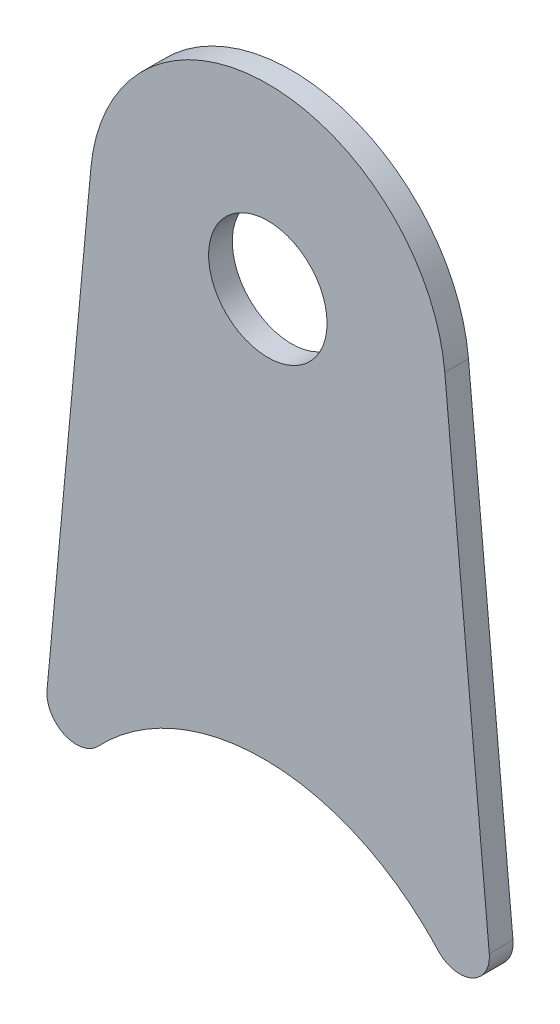
ISO-10303-21;
HEADER;
FILE_DESCRIPTION(('STEP AP214'),'2;1');
FILE_NAME('part.step','',(''),(''),'','','');
FILE_SCHEMA(('AUTOMOTIVE_DESIGN { 1 0 10303 214 1 1 1 1 }'));
ENDSEC;
DATA;
#1=APPLICATION_CONTEXT('core data for automotive mechanical design processes');
#2=APPLICATION_PROTOCOL_DEFINITION('international standard','automotive_design',2000,#1);
#3=PRODUCT_CONTEXT('',#1,'mechanical');
#4=PRODUCT('Part','Part','',(#3));
#5=PRODUCT_RELATED_PRODUCT_CATEGORY('part','',(#4));
#6=PRODUCT_DEFINITION_FORMATION('','',#4);
#7=PRODUCT_DEFINITION_CONTEXT('part definition',#1,'design');
#8=PRODUCT_DEFINITION('design','',#6,#7);
#9=PRODUCT_DEFINITION_SHAPE('','',#8);
#10=(LENGTH_UNIT() NAMED_UNIT(*) SI_UNIT(.MILLI.,.METRE.));
#11=(NAMED_UNIT(*) PLANE_ANGLE_UNIT() SI_UNIT($,.RADIAN.));
#12=(NAMED_UNIT(*) SI_UNIT($,.STERADIAN.) SOLID_ANGLE_UNIT());
#13=UNCERTAINTY_MEASURE_WITH_UNIT(LENGTH_MEASURE(1.E-05),#10,'distance_accuracy_value','');
#14=(GEOMETRIC_REPRESENTATION_CONTEXT(3) GLOBAL_UNCERTAINTY_ASSIGNED_CONTEXT((#13)) GLOBAL_UNIT_ASSIGNED_CONTEXT((#10,
#11,#12)) REPRESENTATION_CONTEXT('',''));
#15=CARTESIAN_POINT('',(0.,0.,0.));
#16=DIRECTION('',(0.,0.,1.));
#17=DIRECTION('',(1.,0.,0.));
#18=AXIS2_PLACEMENT_3D('',#15,#16,#17);
#19=CARTESIAN_POINT('',(-9.48454518351216,0.876942222678502,0.635));
#20=DIRECTION('',(-0.99575277517188,0.0920674249531235,0.));
#21=DIRECTION('',(-0.0920674249531235,-0.99575277517188,0.));
#22=AXIS2_PLACEMENT_3D('',#19,#20,#21);
#23=PLANE('',#22);
#24=DIRECTION('',(-0.0920674249531235,-0.99575277517188,0.));
#25=VECTOR('',#24,1.);
#26=CARTESIAN_POINT('',(-9.48454518351216,0.876942222678502,-0.635));
#27=LINE('',#26,#25);
#28=CARTESIAN_POINT('',(-9.48454518351216,0.876942222678502,-0.635));
#29=VERTEX_POINT('',#28);
#30=CARTESIAN_POINT('',(-11.8340238563607,-24.5337816015981,-0.635));
#31=VERTEX_POINT('',#30);
#32=EDGE_CURVE('E176',#29,#31,#27,.T.);
#33=ORIENTED_EDGE('',*,*,#32,.T.);
#34=DIRECTION('',(0.,0.,-1.));
#35=VECTOR('',#34,1.);
#36=CARTESIAN_POINT('',(-11.8340238563607,-24.5337816015981,0.635));
#37=LINE('',#36,#35);
#38=CARTESIAN_POINT('',(-11.8340238563607,-24.5337816015981,0.635));
#39=VERTEX_POINT('',#38);
#40=EDGE_CURVE('E132',#39,#31,#37,.T.);
#41=ORIENTED_EDGE('',*,*,#40,.F.);
#42=DIRECTION('',(-0.0920674249531235,-0.99575277517188,0.));
#43=VECTOR('',#42,1.);
#44=CARTESIAN_POINT('',(-9.48454518351216,0.876942222678502,0.635));
#45=LINE('',#44,#43);
#46=CARTESIAN_POINT('',(-9.48454518351216,0.876942222678502,0.635));
#47=VERTEX_POINT('',#46);
#48=EDGE_CURVE('E142',#47,#39,#45,.T.);
#49=ORIENTED_EDGE('',*,*,#48,.F.);
#50=DIRECTION('',(0.,0.,1.));
#51=VECTOR('',#50,1.);
#52=CARTESIAN_POINT('',(-9.48454518351216,0.876942222678502,0.635));
#53=LINE('',#52,#51);
#54=EDGE_CURVE('E51',#29,#47,#53,.T.);
#55=ORIENTED_EDGE('',*,*,#54,.F.);
#56=EDGE_LOOP('',(#33,#41,#49,#55));
#57=FACE_BOUND('',#56,.T.);
#58=ADVANCED_FACE('F47',(#57),#23,.T.);
#59=CARTESIAN_POINT('',(0.,0.,0.635));
#60=DIRECTION('',(0.,0.,1.));
#61=DIRECTION('',(1.,0.,0.));
#62=AXIS2_PLACEMENT_3D('',#59,#60,#61);
#63=PLANE('',#62);
#64=CARTESIAN_POINT('',(0.,0.,0.635));
#65=DIRECTION('',(0.,0.,1.));
#66=DIRECTION('',(1.,0.,0.));
#67=AXIS2_PLACEMENT_3D('',#64,#65,#66);
#68=CIRCLE('',#67,3.175);
#69=CARTESIAN_POINT('',(3.175,0.,0.635));
#70=VERTEX_POINT('',#69);
#71=EDGE_CURVE('E205',#70,#70,#68,.T.);
#72=ORIENTED_EDGE('',*,*,#71,.F.);
#73=EDGE_LOOP('',(#72));
#74=FACE_BOUND('',#73,.T.);
#75=CARTESIAN_POINT('',(10.2883354061451,-25.0592273406452,0.635));
#76=DIRECTION('',(0.,0.,1.));
#77=DIRECTION('',(-1.,0.,0.));
#78=AXIS2_PLACEMENT_3D('',#75,#76,#77);
#79=CIRCLE('',#78,1.5875);
#80=CARTESIAN_POINT('',(9.11252793255478,-26.1258261569998,0.635));
#81=VERTEX_POINT('',#80);
#82=CARTESIAN_POINT('',(11.8690929367305,-24.9130703035321,0.635));
#83=VERTEX_POINT('',#82);
#84=EDGE_CURVE('E138',#81,#83,#79,.T.);
#85=ORIENTED_EDGE('',*,*,#84,.T.);
#86=DIRECTION('',(-0.0920674249531237,0.99575277517188,0.));
#87=VECTOR('',#86,1.);
#88=CARTESIAN_POINT('',(12.1153718515477,-27.576693327858,0.635));
#89=LINE('',#88,#87);
#90=CARTESIAN_POINT('',(9.48454518351216,0.876942222678502,0.635));
#91=VERTEX_POINT('',#90);
#92=EDGE_CURVE('E77',#83,#91,#89,.T.);
#93=ORIENTED_EDGE('',*,*,#92,.T.);
#94=CARTESIAN_POINT('',(0.,0.,0.635));
#95=DIRECTION('',(0.,0.,1.));
#96=DIRECTION('',(1.,0.,0.));
#97=AXIS2_PLACEMENT_3D('',#94,#95,#96);
#98=CIRCLE('',#97,9.525);
#99=EDGE_CURVE('E194',#91,#47,#98,.T.);
#100=ORIENTED_EDGE('',*,*,#99,.T.);
#101=ORIENTED_EDGE('',*,*,#48,.T.);
#102=CARTESIAN_POINT('',(-10.2532663257754,-24.6799386387111,0.635));
#103=DIRECTION('',(0.,0.,1.));
#104=DIRECTION('',(-1.,0.,0.));
#105=AXIS2_PLACEMENT_3D('',#102,#103,#104);
#106=CIRCLE('',#105,1.5875);
#107=CARTESIAN_POINT('',(-9.10198881372552,-25.7729694435141,0.635));
#108=VERTEX_POINT('',#107);
#109=EDGE_CURVE('E122',#39,#108,#106,.T.);
#110=ORIENTED_EDGE('',*,*,#109,.T.);
#111=CARTESIAN_POINT('',(-0.0362278599124225,-35.2588461654193,0.635));
#112=DIRECTION('',(0.,0.,-1.));
#113=DIRECTION('',(-0.137713202483371,0.99047214693891,0.));
#114=AXIS2_PLACEMENT_3D('',#111,#112,#113);
#115=ELLIPSE('',#114,13.3575628996056,12.7);
#116=EDGE_CURVE('E135',#108,#81,#115,.T.);
#117=ORIENTED_EDGE('',*,*,#116,.T.);
#118=EDGE_LOOP('',(#85,#93,#100,#101,#110,#117));
#119=FACE_BOUND('',#118,.T.);
#120=ADVANCED_FACE('F141',(#74,#119),#63,.T.);
#121=CARTESIAN_POINT('',(0.,0.,-0.635));
#122=DIRECTION('',(0.,0.,1.));
#123=DIRECTION('',(1.,0.,0.));
#124=AXIS2_PLACEMENT_3D('',#121,#122,#123);
#125=PLANE('',#124);
#126=CARTESIAN_POINT('',(0.,0.,-0.635));
#127=DIRECTION('',(0.,0.,1.));
#128=DIRECTION('',(1.,0.,0.));
#129=AXIS2_PLACEMENT_3D('',#126,#127,#128);
#130=CIRCLE('',#129,3.175);
#131=CARTESIAN_POINT('',(3.175,0.,-0.635));
#132=VERTEX_POINT('',#131);
#133=EDGE_CURVE('E187',#132,#132,#130,.T.);
#134=ORIENTED_EDGE('',*,*,#133,.T.);
#135=EDGE_LOOP('',(#134));
#136=FACE_BOUND('',#135,.T.);
#137=DIRECTION('',(-0.0920674249531237,0.99575277517188,0.));
#138=VECTOR('',#137,1.);
#139=CARTESIAN_POINT('',(12.1153718515477,-27.576693327858,-0.635));
#140=LINE('',#139,#138);
#141=CARTESIAN_POINT('',(11.8690929367305,-24.9130703035321,-0.635));
#142=VERTEX_POINT('',#141);
#143=CARTESIAN_POINT('',(9.48454518351216,0.876942222678502,-0.635));
#144=VERTEX_POINT('',#143);
#145=EDGE_CURVE('E181',#142,#144,#140,.T.);
#146=ORIENTED_EDGE('',*,*,#145,.F.);
#147=CARTESIAN_POINT('',(10.2883354061451,-25.0592273406452,-0.635));
#148=DIRECTION('',(0.,0.,1.));
#149=DIRECTION('',(-1.,0.,0.));
#150=AXIS2_PLACEMENT_3D('',#147,#148,#149);
#151=CIRCLE('',#150,1.5875);
#152=CARTESIAN_POINT('',(9.11252793255478,-26.1258261569998,-0.635));
#153=VERTEX_POINT('',#152);
#154=EDGE_CURVE('E118',#153,#142,#151,.T.);
#155=ORIENTED_EDGE('',*,*,#154,.F.);
#156=CARTESIAN_POINT('',(-0.0362278599124225,-35.2588461654193,-0.635));
#157=DIRECTION('',(0.,0.,-1.));
#158=DIRECTION('',(-0.137713202483371,0.99047214693891,0.));
#159=AXIS2_PLACEMENT_3D('',#156,#157,#158);
#160=ELLIPSE('',#159,13.3575628996056,12.7);
#161=CARTESIAN_POINT('',(-9.10198881372551,-25.7729694435141,-0.635));
#162=VERTEX_POINT('',#161);
#163=EDGE_CURVE('E147',#162,#153,#160,.T.);
#164=ORIENTED_EDGE('',*,*,#163,.F.);
#165=CARTESIAN_POINT('',(-10.2532663257754,-24.6799386387111,-0.635));
#166=DIRECTION('',(0.,0.,1.));
#167=DIRECTION('',(-1.,0.,0.));
#168=AXIS2_PLACEMENT_3D('',#165,#166,#167);
#169=CIRCLE('',#168,1.5875);
#170=EDGE_CURVE('E66',#31,#162,#169,.T.);
#171=ORIENTED_EDGE('',*,*,#170,.F.);
#172=ORIENTED_EDGE('',*,*,#32,.F.);
#173=CARTESIAN_POINT('',(0.,0.,-0.635));
#174=DIRECTION('',(0.,0.,1.));
#175=DIRECTION('',(1.,0.,0.));
#176=AXIS2_PLACEMENT_3D('',#173,#174,#175);
#177=CIRCLE('',#176,9.525);
#178=EDGE_CURVE('E182',#144,#29,#177,.T.);
#179=ORIENTED_EDGE('',*,*,#178,.F.);
#180=EDGE_LOOP('',(#146,#155,#164,#171,#172,#179));
#181=FACE_BOUND('',#180,.T.);
#182=ADVANCED_FACE('F161',(#136,#181),#125,.F.);
#183=CARTESIAN_POINT('',(12.1153718515477,-27.576693327858,0.635));
#184=DIRECTION('',(0.99575277517188,0.0920674249531237,0.));
#185=DIRECTION('',(-0.0920674249531237,0.99575277517188,0.));
#186=AXIS2_PLACEMENT_3D('',#183,#184,#185);
#187=PLANE('',#186);
#188=DIRECTION('',(0.,0.,-1.));
#189=VECTOR('',#188,1.);
#190=CARTESIAN_POINT('',(11.8690929367305,-24.9130703035321,0.635));
#191=LINE('',#190,#189);
#192=EDGE_CURVE('E102',#83,#142,#191,.T.);
#193=ORIENTED_EDGE('',*,*,#192,.T.);
#194=ORIENTED_EDGE('',*,*,#145,.T.);
#195=DIRECTION('',(0.,0.,1.));
#196=VECTOR('',#195,1.);
#197=CARTESIAN_POINT('',(9.48454518351216,0.876942222678502,0.635));
#198=LINE('',#197,#196);
#199=EDGE_CURVE('E11',#144,#91,#198,.T.);
#200=ORIENTED_EDGE('',*,*,#199,.T.);
#201=ORIENTED_EDGE('',*,*,#92,.F.);
#202=EDGE_LOOP('',(#193,#194,#200,#201));
#203=FACE_BOUND('',#202,.T.);
#204=ADVANCED_FACE('F165',(#203),#187,.T.);
#205=CARTESIAN_POINT('',(0.,0.,0.635));
#206=DIRECTION('',(0.,0.,1.));
#207=DIRECTION('',(1.,0.,0.));
#208=AXIS2_PLACEMENT_3D('',#205,#206,#207);
#209=CYLINDRICAL_SURFACE('',#208,9.525);
#210=ORIENTED_EDGE('',*,*,#199,.F.);
#211=ORIENTED_EDGE('',*,*,#178,.T.);
#212=ORIENTED_EDGE('',*,*,#54,.T.);
#213=ORIENTED_EDGE('',*,*,#99,.F.);
#214=EDGE_LOOP('',(#210,#211,#212,#213));
#215=FACE_BOUND('',#214,.T.);
#216=ADVANCED_FACE('F167',(#215),#209,.T.);
#217=CARTESIAN_POINT('',(0.,0.,0.635));
#218=DIRECTION('',(0.,0.,1.));
#219=DIRECTION('',(1.,0.,0.));
#220=AXIS2_PLACEMENT_3D('',#217,#218,#219);
#221=CYLINDRICAL_SURFACE('',#220,3.175);
#222=ORIENTED_EDGE('',*,*,#71,.T.);
#223=EDGE_LOOP('',(#222));
#224=FACE_BOUND('',#223,.T.);
#225=ORIENTED_EDGE('',*,*,#133,.F.);
#226=EDGE_LOOP('',(#225));
#227=FACE_BOUND('',#226,.T.);
#228=ADVANCED_FACE('F49',(#224,#227),#221,.F.);
#229=CARTESIAN_POINT('',(10.2883354061451,-25.0592273406452,0.635));
#230=DIRECTION('',(0.,0.,-1.));
#231=DIRECTION('',(-1.,0.,0.));
#232=AXIS2_PLACEMENT_3D('',#229,#230,#231);
#233=CYLINDRICAL_SURFACE('',#232,1.5875);
#234=ORIENTED_EDGE('',*,*,#154,.T.);
#235=ORIENTED_EDGE('',*,*,#192,.F.);
#236=ORIENTED_EDGE('',*,*,#84,.F.);
#237=DIRECTION('',(0.,0.,-1.));
#238=VECTOR('',#237,1.);
#239=CARTESIAN_POINT('',(9.11252793255478,-26.1258261569998,0.635));
#240=LINE('',#239,#238);
#241=EDGE_CURVE('E131',#81,#153,#240,.T.);
#242=ORIENTED_EDGE('',*,*,#241,.T.);
#243=EDGE_LOOP('',(#234,#235,#236,#242));
#244=FACE_BOUND('',#243,.T.);
#245=ADVANCED_FACE('F156',(#244),#233,.T.);
#246=DIRECTION('',(0.,0.,-1.));
#247=VECTOR('',#246,1.);
#248=SURFACE_OF_LINEAR_EXTRUSION('',#115,#247);
#249=ORIENTED_EDGE('',*,*,#163,.T.);
#250=ORIENTED_EDGE('',*,*,#241,.F.);
#251=ORIENTED_EDGE('',*,*,#116,.F.);
#252=DIRECTION('',(0.,0.,-1.));
#253=VECTOR('',#252,1.);
#254=CARTESIAN_POINT('',(-9.10198881372552,-25.7729694435141,0.635));
#255=LINE('',#254,#253);
#256=EDGE_CURVE('E124',#108,#162,#255,.T.);
#257=ORIENTED_EDGE('',*,*,#256,.T.);
#258=EDGE_LOOP('',(#249,#250,#251,#257));
#259=FACE_BOUND('',#258,.T.);
#260=ADVANCED_FACE('F136',(#259),#248,.F.);
#261=CARTESIAN_POINT('',(-10.2532663257754,-24.6799386387111,0.635));
#262=DIRECTION('',(0.,0.,-1.));
#263=DIRECTION('',(-1.,0.,0.));
#264=AXIS2_PLACEMENT_3D('',#261,#262,#263);
#265=CYLINDRICAL_SURFACE('',#264,1.5875);
#266=ORIENTED_EDGE('',*,*,#170,.T.);
#267=ORIENTED_EDGE('',*,*,#256,.F.);
#268=ORIENTED_EDGE('',*,*,#109,.F.);
#269=ORIENTED_EDGE('',*,*,#40,.T.);
#270=EDGE_LOOP('',(#266,#267,#268,#269));
#271=FACE_BOUND('',#270,.T.);
#272=ADVANCED_FACE('F126',(#271),#265,.T.);
#273=CLOSED_SHELL('',(#58,#120,#182,#204,#216,#228,#245,#260,#272));
#274=MANIFOLD_SOLID_BREP('B2',#273);
#275=ADVANCED_BREP_SHAPE_REPRESENTATION('',(#18,#274),#14);
#276=SHAPE_DEFINITION_REPRESENTATION(#9,#275);
ENDSEC;
END-ISO-10303-21;
